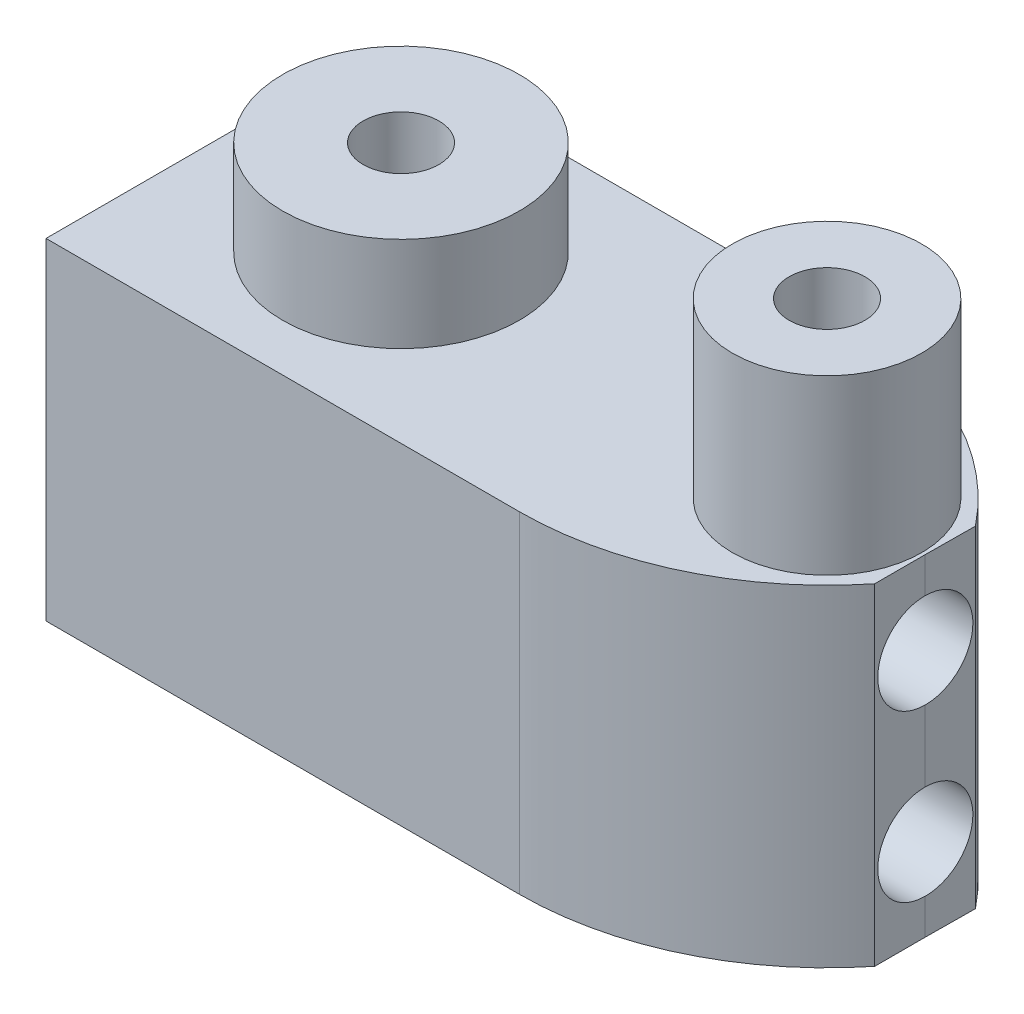
ISO-10303-21;
HEADER;
FILE_DESCRIPTION(('STEP AP214'),'2;1');
FILE_NAME('part.step','',(''),(''),'','','');
FILE_SCHEMA(('AUTOMOTIVE_DESIGN { 1 0 10303 214 1 1 1 1 }'));
ENDSEC;
DATA;
#1=APPLICATION_CONTEXT('core data for automotive mechanical design processes');
#2=APPLICATION_PROTOCOL_DEFINITION('international standard','automotive_design',2000,#1);
#3=PRODUCT_CONTEXT('',#1,'mechanical');
#4=PRODUCT('Part','Part','',(#3));
#5=PRODUCT_RELATED_PRODUCT_CATEGORY('part','',(#4));
#6=PRODUCT_DEFINITION_FORMATION('','',#4);
#7=PRODUCT_DEFINITION_CONTEXT('part definition',#1,'design');
#8=PRODUCT_DEFINITION('design','',#6,#7);
#9=PRODUCT_DEFINITION_SHAPE('','',#8);
#10=(LENGTH_UNIT() NAMED_UNIT(*) SI_UNIT(.MILLI.,.METRE.));
#11=(NAMED_UNIT(*) PLANE_ANGLE_UNIT() SI_UNIT($,.RADIAN.));
#12=(NAMED_UNIT(*) SI_UNIT($,.STERADIAN.) SOLID_ANGLE_UNIT());
#13=UNCERTAINTY_MEASURE_WITH_UNIT(LENGTH_MEASURE(1.E-05),#10,'distance_accuracy_value','');
#14=(GEOMETRIC_REPRESENTATION_CONTEXT(3) GLOBAL_UNCERTAINTY_ASSIGNED_CONTEXT((#13)) GLOBAL_UNIT_ASSIGNED_CONTEXT((#10,
#11,#12)) REPRESENTATION_CONTEXT('',''));
#15=CARTESIAN_POINT('',(0.,0.,0.));
#16=DIRECTION('',(0.,0.,1.));
#17=DIRECTION('',(1.,0.,0.));
#18=AXIS2_PLACEMENT_3D('',#15,#16,#17);
#19=CARTESIAN_POINT('',(3.5,14.,-6.));
#20=DIRECTION('',(0.,-1.,0.));
#21=DIRECTION('',(0.,0.,-1.));
#22=AXIS2_PLACEMENT_3D('',#19,#20,#21);
#23=CYLINDRICAL_SURFACE('',#22,13.);
#24=CARTESIAN_POINT('',(3.5,0.,-6.));
#25=DIRECTION('',(0.,1.,0.));
#26=DIRECTION('',(0.,0.,1.));
#27=AXIS2_PLACEMENT_3D('',#24,#25,#26);
#28=CIRCLE('',#27,13.);
#29=CARTESIAN_POINT('',(13.6440740438536,0.,2.13005300061545));
#30=VERTEX_POINT('',#29);
#31=CARTESIAN_POINT('',(3.5,0.,7.));
#32=VERTEX_POINT('',#31);
#33=EDGE_CURVE('E158',#30,#32,#28,.F.);
#34=ORIENTED_EDGE('',*,*,#33,.F.);
#35=DIRECTION('',(0.,-1.,0.));
#36=VECTOR('',#35,1.);
#37=CARTESIAN_POINT('',(13.6440740438536,21.3,2.13005300061545));
#38=LINE('',#37,#36);
#39=CARTESIAN_POINT('',(13.6440740438536,14.,2.13005300061545));
#40=VERTEX_POINT('',#39);
#41=EDGE_CURVE('E143',#40,#30,#38,.T.);
#42=ORIENTED_EDGE('',*,*,#41,.F.);
#43=CARTESIAN_POINT('',(3.5,14.,-6.));
#44=DIRECTION('',(0.,1.,0.));
#45=DIRECTION('',(0.,0.,1.));
#46=AXIS2_PLACEMENT_3D('',#43,#44,#45);
#47=CIRCLE('',#46,13.);
#48=CARTESIAN_POINT('',(3.5,14.,7.));
#49=VERTEX_POINT('',#48);
#50=EDGE_CURVE('E157',#49,#40,#47,.T.);
#51=ORIENTED_EDGE('',*,*,#50,.F.);
#52=DIRECTION('',(0.,-1.,0.));
#53=VECTOR('',#52,1.);
#54=CARTESIAN_POINT('',(3.5,14.,7.));
#55=LINE('',#54,#53);
#56=EDGE_CURVE('E168',#32,#49,#55,.F.);
#57=ORIENTED_EDGE('',*,*,#56,.F.);
#58=EDGE_LOOP('',(#34,#42,#51,#57));
#59=FACE_BOUND('',#58,.T.);
#60=ADVANCED_FACE('F49',(#59),#23,.T.);
#61=CARTESIAN_POINT('',(-16.5,14.,-7.));
#62=DIRECTION('',(0.,0.,1.));
#63=DIRECTION('',(1.,0.,0.));
#64=AXIS2_PLACEMENT_3D('',#61,#62,#63);
#65=PLANE('',#64);
#66=DIRECTION('',(-1.,0.,0.));
#67=VECTOR('',#66,1.);
#68=CARTESIAN_POINT('',(-16.5,14.,-7.));
#69=LINE('',#68,#67);
#70=CARTESIAN_POINT('',(3.50000000000001,14.,-7.));
#71=VERTEX_POINT('',#70);
#72=CARTESIAN_POINT('',(-16.5,14.,-7.));
#73=VERTEX_POINT('',#72);
#74=EDGE_CURVE('E235',#71,#73,#69,.T.);
#75=ORIENTED_EDGE('',*,*,#74,.F.);
#76=DIRECTION('',(0.,-1.,0.));
#77=VECTOR('',#76,1.);
#78=CARTESIAN_POINT('',(3.50000000000001,14.,-7.));
#79=LINE('',#78,#77);
#80=CARTESIAN_POINT('',(3.50000000000001,0.,-7.));
#81=VERTEX_POINT('',#80);
#82=EDGE_CURVE('E259',#71,#81,#79,.T.);
#83=ORIENTED_EDGE('',*,*,#82,.T.);
#84=DIRECTION('',(-1.,0.,0.));
#85=VECTOR('',#84,1.);
#86=CARTESIAN_POINT('',(-16.5,0.,-7.));
#87=LINE('',#86,#85);
#88=CARTESIAN_POINT('',(-16.5,0.,-7.));
#89=VERTEX_POINT('',#88);
#90=EDGE_CURVE('E228',#81,#89,#87,.T.);
#91=ORIENTED_EDGE('',*,*,#90,.T.);
#92=DIRECTION('',(0.,-1.,0.));
#93=VECTOR('',#92,1.);
#94=CARTESIAN_POINT('',(-16.5,14.,-7.));
#95=LINE('',#94,#93);
#96=EDGE_CURVE('E249',#73,#89,#95,.T.);
#97=ORIENTED_EDGE('',*,*,#96,.F.);
#98=EDGE_LOOP('',(#75,#83,#91,#97));
#99=FACE_BOUND('',#98,.T.);
#100=ADVANCED_FACE('F276',(#99),#65,.F.);
#101=CARTESIAN_POINT('',(-16.5,14.,-7.));
#102=DIRECTION('',(1.,0.,0.));
#103=DIRECTION('',(0.,0.,-1.));
#104=AXIS2_PLACEMENT_3D('',#101,#102,#103);
#105=PLANE('',#104);
#106=DIRECTION('',(0.,-1.,0.));
#107=VECTOR('',#106,1.);
#108=CARTESIAN_POINT('',(-16.5,13.,5.));
#109=LINE('',#108,#107);
#110=CARTESIAN_POINT('',(-16.5,13.,5.));
#111=VERTEX_POINT('',#110);
#112=CARTESIAN_POINT('',(-16.5,0.999999999999999,5.));
#113=VERTEX_POINT('',#112);
#114=EDGE_CURVE('E217',#111,#113,#109,.T.);
#115=ORIENTED_EDGE('',*,*,#114,.T.);
#116=DIRECTION('',(0.,0.,1.));
#117=VECTOR('',#116,1.);
#118=CARTESIAN_POINT('',(-16.5,1.,-5.));
#119=LINE('',#118,#117);
#120=CARTESIAN_POINT('',(-16.5,1.,-5.));
#121=VERTEX_POINT('',#120);
#122=EDGE_CURVE('E215',#121,#113,#119,.T.);
#123=ORIENTED_EDGE('',*,*,#122,.F.);
#124=DIRECTION('',(0.,-1.,0.));
#125=VECTOR('',#124,1.);
#126=CARTESIAN_POINT('',(-16.5,13.,-5.));
#127=LINE('',#126,#125);
#128=CARTESIAN_POINT('',(-16.5,13.,-5.));
#129=VERTEX_POINT('',#128);
#130=EDGE_CURVE('E207',#129,#121,#127,.T.);
#131=ORIENTED_EDGE('',*,*,#130,.F.);
#132=DIRECTION('',(0.,0.,1.));
#133=VECTOR('',#132,1.);
#134=CARTESIAN_POINT('',(-16.5,13.,-5.));
#135=LINE('',#134,#133);
#136=EDGE_CURVE('E221',#129,#111,#135,.T.);
#137=ORIENTED_EDGE('',*,*,#136,.T.);
#138=EDGE_LOOP('',(#115,#123,#131,#137));
#139=FACE_BOUND('',#138,.T.);
#140=DIRECTION('',(0.,0.,1.));
#141=VECTOR('',#140,1.);
#142=CARTESIAN_POINT('',(-16.5,0.,-7.));
#143=LINE('',#142,#141);
#144=CARTESIAN_POINT('',(-16.5,0.,7.));
#145=VERTEX_POINT('',#144);
#146=EDGE_CURVE('E243',#89,#145,#143,.T.);
#147=ORIENTED_EDGE('',*,*,#146,.T.);
#148=DIRECTION('',(0.,-1.,0.));
#149=VECTOR('',#148,1.);
#150=CARTESIAN_POINT('',(-16.5,14.,7.));
#151=LINE('',#150,#149);
#152=CARTESIAN_POINT('',(-16.5,14.,7.));
#153=VERTEX_POINT('',#152);
#154=EDGE_CURVE('E241',#153,#145,#151,.T.);
#155=ORIENTED_EDGE('',*,*,#154,.F.);
#156=DIRECTION('',(0.,0.,1.));
#157=VECTOR('',#156,1.);
#158=CARTESIAN_POINT('',(-16.5,14.,-7.));
#159=LINE('',#158,#157);
#160=EDGE_CURVE('E237',#73,#153,#159,.T.);
#161=ORIENTED_EDGE('',*,*,#160,.F.);
#162=ORIENTED_EDGE('',*,*,#96,.T.);
#163=EDGE_LOOP('',(#147,#155,#161,#162));
#164=FACE_BOUND('',#163,.T.);
#165=ADVANCED_FACE('F271',(#139,#164),#105,.F.);
#166=CARTESIAN_POINT('',(-16.5,14.,7.));
#167=DIRECTION('',(0.,0.,-1.));
#168=DIRECTION('',(-1.,0.,0.));
#169=AXIS2_PLACEMENT_3D('',#166,#167,#168);
#170=PLANE('',#169);
#171=DIRECTION('',(1.,0.,0.));
#172=VECTOR('',#171,1.);
#173=CARTESIAN_POINT('',(-16.5,0.,7.));
#174=LINE('',#173,#172);
#175=EDGE_CURVE('E238',#145,#32,#174,.T.);
#176=ORIENTED_EDGE('',*,*,#175,.T.);
#177=ORIENTED_EDGE('',*,*,#56,.T.);
#178=DIRECTION('',(1.,0.,0.));
#179=VECTOR('',#178,1.);
#180=CARTESIAN_POINT('',(-16.5,14.,7.));
#181=LINE('',#180,#179);
#182=EDGE_CURVE('E164',#153,#49,#181,.T.);
#183=ORIENTED_EDGE('',*,*,#182,.F.);
#184=ORIENTED_EDGE('',*,*,#154,.T.);
#185=EDGE_LOOP('',(#176,#177,#183,#184));
#186=FACE_BOUND('',#185,.T.);
#187=ADVANCED_FACE('F267',(#186),#170,.F.);
#188=CARTESIAN_POINT('',(0.,14.,0.));
#189=DIRECTION('',(0.,1.,0.));
#190=DIRECTION('',(0.,0.,1.));
#191=AXIS2_PLACEMENT_3D('',#188,#189,#190);
#192=PLANE('',#191);
#193=DIRECTION('',(-0.00887810960126429,0.,0.999960588808333));
#194=VECTOR('',#193,1.);
#195=CARTESIAN_POINT('',(13.6429986066116,14.,0.121128810750171));
#196=LINE('',#195,#194);
#197=CARTESIAN_POINT('',(13.6627779438096,14.,-2.1066605001577));
#198=VERTEX_POINT('',#197);
#199=CARTESIAN_POINT('',(13.6440740438536,14.,0.));
#200=VERTEX_POINT('',#199);
#201=EDGE_CURVE('E284',#198,#200,#196,.T.);
#202=ORIENTED_EDGE('',*,*,#201,.F.);
#203=CARTESIAN_POINT('',(3.50000000000001,14.,6.));
#204=DIRECTION('',(0.,1.,0.));
#205=DIRECTION('',(0.,0.,1.));
#206=AXIS2_PLACEMENT_3D('',#203,#204,#205);
#207=CIRCLE('',#206,13.);
#208=EDGE_CURVE('E165',#198,#71,#207,.T.);
#209=ORIENTED_EDGE('',*,*,#208,.T.);
#210=ORIENTED_EDGE('',*,*,#74,.T.);
#211=ORIENTED_EDGE('',*,*,#160,.T.);
#212=ORIENTED_EDGE('',*,*,#182,.T.);
#213=ORIENTED_EDGE('',*,*,#50,.T.);
#214=DIRECTION('',(0.,0.,-1.));
#215=VECTOR('',#214,1.);
#216=CARTESIAN_POINT('',(13.6440740438536,14.,0.));
#217=LINE('',#216,#215);
#218=EDGE_CURVE('E140',#40,#200,#217,.T.);
#219=ORIENTED_EDGE('',*,*,#218,.T.);
#220=EDGE_LOOP('',(#202,#209,#210,#211,#212,#213,#219));
#221=FACE_BOUND('',#220,.T.);
#222=CARTESIAN_POINT('',(9.50000000000487,14.,-9.87057657830803E-13));
#223=DIRECTION('',(0.,1.,0.));
#224=DIRECTION('',(0.,0.,1.));
#225=AXIS2_PLACEMENT_3D('',#222,#223,#224);
#226=CIRCLE('',#225,3.99999999999506);
#227=CARTESIAN_POINT('',(9.50000000000487,14.,3.99999999999407));
#228=VERTEX_POINT('',#227);
#229=EDGE_CURVE('E187',#228,#228,#226,.T.);
#230=ORIENTED_EDGE('',*,*,#229,.F.);
#231=EDGE_LOOP('',(#230));
#232=FACE_BOUND('',#231,.T.);
#233=CARTESIAN_POINT('',(-8.5,14.,0.));
#234=DIRECTION('',(0.,1.,0.));
#235=DIRECTION('',(0.,0.,1.));
#236=AXIS2_PLACEMENT_3D('',#233,#234,#235);
#237=CIRCLE('',#236,5.);
#238=CARTESIAN_POINT('',(-8.5,14.,5.));
#239=VERTEX_POINT('',#238);
#240=EDGE_CURVE('E191',#239,#239,#237,.T.);
#241=ORIENTED_EDGE('',*,*,#240,.F.);
#242=EDGE_LOOP('',(#241));
#243=FACE_BOUND('',#242,.T.);
#244=ADVANCED_FACE('F161',(#221,#232,#243),#192,.T.);
#245=CARTESIAN_POINT('',(0.,0.,0.));
#246=DIRECTION('',(0.,1.,0.));
#247=DIRECTION('',(0.,0.,1.));
#248=AXIS2_PLACEMENT_3D('',#245,#246,#247);
#249=PLANE('',#248);
#250=CARTESIAN_POINT('',(-8.5,0.,0.));
#251=DIRECTION('',(0.,-1.,0.));
#252=DIRECTION('',(0.,0.,-1.));
#253=AXIS2_PLACEMENT_3D('',#250,#251,#252);
#254=CIRCLE('',#253,2.5);
#255=CARTESIAN_POINT('',(-8.5,0.,-2.5));
#256=VERTEX_POINT('',#255);
#257=EDGE_CURVE('E56',#256,#256,#254,.T.);
#258=ORIENTED_EDGE('',*,*,#257,.F.);
#259=EDGE_LOOP('',(#258));
#260=FACE_BOUND('',#259,.T.);
#261=CARTESIAN_POINT('',(3.50000000000001,0.,6.));
#262=DIRECTION('',(0.,1.,0.));
#263=DIRECTION('',(0.,0.,1.));
#264=AXIS2_PLACEMENT_3D('',#261,#262,#263);
#265=CIRCLE('',#264,13.);
#266=CARTESIAN_POINT('',(13.6627779438096,0.,-2.1066605001577));
#267=VERTEX_POINT('',#266);
#268=EDGE_CURVE('E166',#81,#267,#265,.F.);
#269=ORIENTED_EDGE('',*,*,#268,.T.);
#270=DIRECTION('',(-0.00887810960126429,0.,0.999960588808333));
#271=VECTOR('',#270,1.);
#272=CARTESIAN_POINT('',(13.6429986066116,0.,0.121128810750171));
#273=LINE('',#272,#271);
#274=CARTESIAN_POINT('',(13.6440740438536,0.,0.));
#275=VERTEX_POINT('',#274);
#276=EDGE_CURVE('E285',#267,#275,#273,.T.);
#277=ORIENTED_EDGE('',*,*,#276,.T.);
#278=DIRECTION('',(0.,0.,-1.));
#279=VECTOR('',#278,1.);
#280=CARTESIAN_POINT('',(13.6440740438536,0.,0.));
#281=LINE('',#280,#279);
#282=EDGE_CURVE('E151',#30,#275,#281,.T.);
#283=ORIENTED_EDGE('',*,*,#282,.F.);
#284=ORIENTED_EDGE('',*,*,#33,.T.);
#285=ORIENTED_EDGE('',*,*,#175,.F.);
#286=ORIENTED_EDGE('',*,*,#146,.F.);
#287=ORIENTED_EDGE('',*,*,#90,.F.);
#288=EDGE_LOOP('',(#269,#277,#283,#284,#285,#286,#287));
#289=FACE_BOUND('',#288,.T.);
#290=ADVANCED_FACE('F263',(#260,#289),#249,.F.);
#291=CARTESIAN_POINT('',(8.8,1.,-5.));
#292=DIRECTION('',(0.,-1.,0.));
#293=DIRECTION('',(0.,0.,-1.));
#294=AXIS2_PLACEMENT_3D('',#291,#292,#293);
#295=PLANE('',#294);
#296=ORIENTED_EDGE('',*,*,#122,.T.);
#297=DIRECTION('',(-1.,0.,0.));
#298=VECTOR('',#297,1.);
#299=CARTESIAN_POINT('',(8.8,1.,5.));
#300=LINE('',#299,#298);
#301=CARTESIAN_POINT('',(8.8,1.,5.));
#302=VERTEX_POINT('',#301);
#303=EDGE_CURVE('E214',#302,#113,#300,.T.);
#304=ORIENTED_EDGE('',*,*,#303,.F.);
#305=DIRECTION('',(0.,0.,1.));
#306=VECTOR('',#305,1.);
#307=CARTESIAN_POINT('',(8.8,1.,-5.));
#308=LINE('',#307,#306);
#309=CARTESIAN_POINT('',(8.8,1.,-5.));
#310=VERTEX_POINT('',#309);
#311=EDGE_CURVE('E203',#310,#302,#308,.T.);
#312=ORIENTED_EDGE('',*,*,#311,.F.);
#313=DIRECTION('',(-1.,0.,0.));
#314=VECTOR('',#313,1.);
#315=CARTESIAN_POINT('',(8.8,1.,-5.));
#316=LINE('',#315,#314);
#317=EDGE_CURVE('E226',#310,#121,#316,.T.);
#318=ORIENTED_EDGE('',*,*,#317,.T.);
#319=EDGE_LOOP('',(#296,#304,#312,#318));
#320=FACE_BOUND('',#319,.T.);
#321=ADVANCED_FACE('F326',(#320),#295,.F.);
#322=CARTESIAN_POINT('',(8.8,13.,-5.));
#323=DIRECTION('',(0.,0.,-1.));
#324=DIRECTION('',(0.,1.,0.));
#325=AXIS2_PLACEMENT_3D('',#322,#323,#324);
#326=PLANE('',#325);
#327=ORIENTED_EDGE('',*,*,#130,.T.);
#328=ORIENTED_EDGE('',*,*,#317,.F.);
#329=DIRECTION('',(0.,-1.,0.));
#330=VECTOR('',#329,1.);
#331=CARTESIAN_POINT('',(8.8,13.,-5.));
#332=LINE('',#331,#330);
#333=CARTESIAN_POINT('',(8.8,13.,-5.));
#334=VERTEX_POINT('',#333);
#335=EDGE_CURVE('E211',#334,#310,#332,.T.);
#336=ORIENTED_EDGE('',*,*,#335,.F.);
#337=DIRECTION('',(-1.,0.,0.));
#338=VECTOR('',#337,1.);
#339=CARTESIAN_POINT('',(8.8,13.,-5.));
#340=LINE('',#339,#338);
#341=EDGE_CURVE('E229',#334,#129,#340,.T.);
#342=ORIENTED_EDGE('',*,*,#341,.T.);
#343=EDGE_LOOP('',(#327,#328,#336,#342));
#344=FACE_BOUND('',#343,.T.);
#345=ADVANCED_FACE('F337',(#344),#326,.F.);
#346=CARTESIAN_POINT('',(8.8,13.,-5.));
#347=DIRECTION('',(0.,-1.,0.));
#348=DIRECTION('',(0.,0.,-1.));
#349=AXIS2_PLACEMENT_3D('',#346,#347,#348);
#350=PLANE('',#349);
#351=ORIENTED_EDGE('',*,*,#136,.F.);
#352=ORIENTED_EDGE('',*,*,#341,.F.);
#353=DIRECTION('',(0.,0.,1.));
#354=VECTOR('',#353,1.);
#355=CARTESIAN_POINT('',(8.8,13.,-5.));
#356=LINE('',#355,#354);
#357=CARTESIAN_POINT('',(8.8,13.,5.));
#358=VERTEX_POINT('',#357);
#359=EDGE_CURVE('E209',#334,#358,#356,.T.);
#360=ORIENTED_EDGE('',*,*,#359,.T.);
#361=DIRECTION('',(-1.,0.,0.));
#362=VECTOR('',#361,1.);
#363=CARTESIAN_POINT('',(8.8,13.,5.));
#364=LINE('',#363,#362);
#365=EDGE_CURVE('E231',#358,#111,#364,.T.);
#366=ORIENTED_EDGE('',*,*,#365,.T.);
#367=EDGE_LOOP('',(#351,#352,#360,#366));
#368=FACE_BOUND('',#367,.T.);
#369=ADVANCED_FACE('F335',(#368),#350,.T.);
#370=CARTESIAN_POINT('',(8.8,13.,5.));
#371=DIRECTION('',(0.,0.,-1.));
#372=DIRECTION('',(-1.,0.,0.));
#373=AXIS2_PLACEMENT_3D('',#370,#371,#372);
#374=PLANE('',#373);
#375=ORIENTED_EDGE('',*,*,#114,.F.);
#376=ORIENTED_EDGE('',*,*,#365,.F.);
#377=DIRECTION('',(0.,-1.,0.));
#378=VECTOR('',#377,1.);
#379=CARTESIAN_POINT('',(8.8,13.,5.));
#380=LINE('',#379,#378);
#381=EDGE_CURVE('E206',#358,#302,#380,.T.);
#382=ORIENTED_EDGE('',*,*,#381,.T.);
#383=ORIENTED_EDGE('',*,*,#303,.T.);
#384=EDGE_LOOP('',(#375,#376,#382,#383));
#385=FACE_BOUND('',#384,.T.);
#386=ADVANCED_FACE('F316',(#385),#374,.T.);
#387=CARTESIAN_POINT('',(8.8,0.,0.));
#388=DIRECTION('',(1.,0.,0.));
#389=DIRECTION('',(0.,0.,-1.));
#390=AXIS2_PLACEMENT_3D('',#387,#388,#389);
#391=PLANE('',#390);
#392=CARTESIAN_POINT('',(8.8,10.5,0.));
#393=DIRECTION('',(1.,0.,0.));
#394=DIRECTION('',(0.,0.,-1.));
#395=AXIS2_PLACEMENT_3D('',#392,#393,#394);
#396=CIRCLE('',#395,2.);
#397=CARTESIAN_POINT('',(8.8,10.5,-2.));
#398=VERTEX_POINT('',#397);
#399=EDGE_CURVE('E218',#398,#398,#396,.T.);
#400=ORIENTED_EDGE('',*,*,#399,.T.);
#401=EDGE_LOOP('',(#400));
#402=FACE_BOUND('',#401,.T.);
#403=CARTESIAN_POINT('',(8.8,3.5,0.));
#404=DIRECTION('',(1.,0.,0.));
#405=DIRECTION('',(0.,0.,-1.));
#406=AXIS2_PLACEMENT_3D('',#403,#404,#405);
#407=CIRCLE('',#406,2.);
#408=CARTESIAN_POINT('',(8.8,3.5,-2.));
#409=VERTEX_POINT('',#408);
#410=EDGE_CURVE('E200',#409,#409,#407,.T.);
#411=ORIENTED_EDGE('',*,*,#410,.T.);
#412=EDGE_LOOP('',(#411));
#413=FACE_BOUND('',#412,.T.);
#414=ORIENTED_EDGE('',*,*,#311,.T.);
#415=ORIENTED_EDGE('',*,*,#381,.F.);
#416=ORIENTED_EDGE('',*,*,#359,.F.);
#417=ORIENTED_EDGE('',*,*,#335,.T.);
#418=EDGE_LOOP('',(#414,#415,#416,#417));
#419=FACE_BOUND('',#418,.T.);
#420=ADVANCED_FACE('F313',(#402,#413,#419),#391,.F.);
#421=CARTESIAN_POINT('',(-8.99999999999999,3.5,0.));
#422=DIRECTION('',(1.,0.,0.));
#423=DIRECTION('',(0.,0.,-1.));
#424=AXIS2_PLACEMENT_3D('',#421,#422,#423);
#425=CYLINDRICAL_SURFACE('',#424,2.);
#426=CARTESIAN_POINT('',(13.6440740438536,3.5,0.));
#427=DIRECTION('',(1.,0.,0.));
#428=DIRECTION('',(0.,0.,-1.));
#429=AXIS2_PLACEMENT_3D('',#426,#427,#428);
#430=CIRCLE('',#429,2.);
#431=CARTESIAN_POINT('',(13.6440740438536,1.5,0.));
#432=VERTEX_POINT('',#431);
#433=CARTESIAN_POINT('',(13.6440740438536,5.5,0.));
#434=VERTEX_POINT('',#433);
#435=EDGE_CURVE('E288',#432,#434,#430,.F.);
#436=ORIENTED_EDGE('',*,*,#435,.F.);
#437=CARTESIAN_POINT('',(13.6440740438536,3.5,0.));
#438=DIRECTION('',(-0.999960588808333,0.,-0.00887810960126429));
#439=DIRECTION('',(0.00887810960126429,0.,-0.999960588808333));
#440=AXIS2_PLACEMENT_3D('',#437,#438,#439);
#441=ELLIPSE('',#440,2.00007882548994,2.);
#442=EDGE_CURVE('E290',#432,#434,#441,.F.);
#443=ORIENTED_EDGE('',*,*,#442,.T.);
#444=EDGE_LOOP('',(#436,#443));
#445=FACE_BOUND('',#444,.T.);
#446=ORIENTED_EDGE('',*,*,#410,.F.);
#447=EDGE_LOOP('',(#446));
#448=FACE_BOUND('',#447,.T.);
#449=ADVANCED_FACE('F304',(#445,#448),#425,.F.);
#450=CARTESIAN_POINT('',(-8.99999999999999,10.5,0.));
#451=DIRECTION('',(1.,0.,0.));
#452=DIRECTION('',(0.,0.,-1.));
#453=AXIS2_PLACEMENT_3D('',#450,#451,#452);
#454=CYLINDRICAL_SURFACE('',#453,2.);
#455=CARTESIAN_POINT('',(13.6440740438536,10.5,0.));
#456=DIRECTION('',(1.,0.,0.));
#457=DIRECTION('',(0.,0.,-1.));
#458=AXIS2_PLACEMENT_3D('',#455,#456,#457);
#459=CIRCLE('',#458,2.);
#460=CARTESIAN_POINT('',(13.6440740438536,8.5,0.));
#461=VERTEX_POINT('',#460);
#462=CARTESIAN_POINT('',(13.6440740438536,12.5,0.));
#463=VERTEX_POINT('',#462);
#464=EDGE_CURVE('E286',#461,#463,#459,.F.);
#465=ORIENTED_EDGE('',*,*,#464,.F.);
#466=CARTESIAN_POINT('',(13.6440740438536,10.5,0.));
#467=DIRECTION('',(-0.999960588808333,0.,-0.00887810960126429));
#468=DIRECTION('',(0.00887810960126429,0.,-0.999960588808333));
#469=AXIS2_PLACEMENT_3D('',#466,#467,#468);
#470=ELLIPSE('',#469,2.00007882548994,2.);
#471=EDGE_CURVE('E299',#461,#463,#470,.F.);
#472=ORIENTED_EDGE('',*,*,#471,.T.);
#473=EDGE_LOOP('',(#465,#472));
#474=FACE_BOUND('',#473,.T.);
#475=ORIENTED_EDGE('',*,*,#399,.F.);
#476=EDGE_LOOP('',(#475));
#477=FACE_BOUND('',#476,.T.);
#478=ADVANCED_FACE('F306',(#474,#477),#454,.F.);
#479=CARTESIAN_POINT('',(-8.5,18.,0.));
#480=DIRECTION('',(0.,-1.,0.));
#481=DIRECTION('',(0.,0.,-1.));
#482=AXIS2_PLACEMENT_3D('',#479,#480,#481);
#483=CYLINDRICAL_SURFACE('',#482,1.6);
#484=CARTESIAN_POINT('',(-8.5,18.,0.));
#485=DIRECTION('',(0.,1.,0.));
#486=DIRECTION('',(0.,0.,1.));
#487=AXIS2_PLACEMENT_3D('',#484,#485,#486);
#488=CIRCLE('',#487,1.6);
#489=CARTESIAN_POINT('',(-8.5,18.,1.6));
#490=VERTEX_POINT('',#489);
#491=EDGE_CURVE('E194',#490,#490,#488,.T.);
#492=ORIENTED_EDGE('',*,*,#491,.T.);
#493=EDGE_LOOP('',(#492));
#494=FACE_BOUND('',#493,.T.);
#495=CARTESIAN_POINT('',(-8.5,14.,0.));
#496=DIRECTION('',(0.,1.,0.));
#497=DIRECTION('',(0.,0.,1.));
#498=AXIS2_PLACEMENT_3D('',#495,#496,#497);
#499=CIRCLE('',#498,1.6);
#500=CARTESIAN_POINT('',(-8.5,14.,1.6));
#501=VERTEX_POINT('',#500);
#502=EDGE_CURVE('E252',#501,#501,#499,.F.);
#503=ORIENTED_EDGE('',*,*,#502,.T.);
#504=EDGE_LOOP('',(#503));
#505=FACE_BOUND('',#504,.T.);
#506=ADVANCED_FACE('F309',(#494,#505),#483,.F.);
#507=CARTESIAN_POINT('',(-8.5,18.,0.));
#508=DIRECTION('',(0.,-1.,0.));
#509=DIRECTION('',(0.,0.,-1.));
#510=AXIS2_PLACEMENT_3D('',#507,#508,#509);
#511=CYLINDRICAL_SURFACE('',#510,5.);
#512=CARTESIAN_POINT('',(-8.5,18.,0.));
#513=DIRECTION('',(0.,1.,0.));
#514=DIRECTION('',(0.,0.,1.));
#515=AXIS2_PLACEMENT_3D('',#512,#513,#514);
#516=CIRCLE('',#515,5.);
#517=CARTESIAN_POINT('',(-8.5,18.,5.));
#518=VERTEX_POINT('',#517);
#519=EDGE_CURVE('E197',#518,#518,#516,.T.);
#520=ORIENTED_EDGE('',*,*,#519,.F.);
#521=EDGE_LOOP('',(#520));
#522=FACE_BOUND('',#521,.T.);
#523=ORIENTED_EDGE('',*,*,#240,.T.);
#524=EDGE_LOOP('',(#523));
#525=FACE_BOUND('',#524,.T.);
#526=ADVANCED_FACE('F377',(#522,#525),#511,.T.);
#527=CARTESIAN_POINT('',(0.,18.,0.));
#528=DIRECTION('',(0.,1.,0.));
#529=DIRECTION('',(0.,0.,1.));
#530=AXIS2_PLACEMENT_3D('',#527,#528,#529);
#531=PLANE('',#530);
#532=ORIENTED_EDGE('',*,*,#491,.F.);
#533=EDGE_LOOP('',(#532));
#534=FACE_BOUND('',#533,.T.);
#535=ORIENTED_EDGE('',*,*,#519,.T.);
#536=EDGE_LOOP('',(#535));
#537=FACE_BOUND('',#536,.T.);
#538=ADVANCED_FACE('F370',(#534,#537),#531,.T.);
#539=ORIENTED_EDGE('',*,*,#502,.F.);
#540=EDGE_LOOP('',(#539));
#541=FACE_BOUND('',#540,.T.);
#542=ADVANCED_FACE('F362',(#541),#192,.T.);
#543=CARTESIAN_POINT('',(3.50000000000001,14.,6.));
#544=DIRECTION('',(0.,-1.,0.));
#545=DIRECTION('',(0.,0.,-1.));
#546=AXIS2_PLACEMENT_3D('',#543,#544,#545);
#547=CYLINDRICAL_SURFACE('',#546,13.);
#548=DIRECTION('',(0.,-1.,0.));
#549=VECTOR('',#548,1.);
#550=CARTESIAN_POINT('',(13.6627779438096,14.,-2.1066605001577));
#551=LINE('',#550,#549);
#552=EDGE_CURVE('E12',#267,#198,#551,.F.);
#553=ORIENTED_EDGE('',*,*,#552,.F.);
#554=ORIENTED_EDGE('',*,*,#268,.F.);
#555=ORIENTED_EDGE('',*,*,#82,.F.);
#556=ORIENTED_EDGE('',*,*,#208,.F.);
#557=EDGE_LOOP('',(#553,#554,#555,#556));
#558=FACE_BOUND('',#557,.T.);
#559=ADVANCED_FACE('F281',(#558),#547,.T.);
#560=CARTESIAN_POINT('',(9.50000000000487,21.3,-9.87057657830803E-13));
#561=DIRECTION('',(0.,1.,0.));
#562=DIRECTION('',(0.,0.,1.));
#563=AXIS2_PLACEMENT_3D('',#560,#561,#562);
#564=PLANE('',#563);
#565=CARTESIAN_POINT('',(9.50000000000487,21.3,-9.87057657830803E-13));
#566=DIRECTION('',(0.,1.,0.));
#567=DIRECTION('',(0.,0.,1.));
#568=AXIS2_PLACEMENT_3D('',#565,#566,#567);
#569=CIRCLE('',#568,3.99999999999506);
#570=CARTESIAN_POINT('',(9.50000000000487,21.3,3.99999999999407));
#571=VERTEX_POINT('',#570);
#572=EDGE_CURVE('E188',#571,#571,#569,.T.);
#573=ORIENTED_EDGE('',*,*,#572,.T.);
#574=EDGE_LOOP('',(#573));
#575=FACE_BOUND('',#574,.T.);
#576=CARTESIAN_POINT('',(9.50000000000487,21.3,-9.87057657830803E-13));
#577=DIRECTION('',(0.,1.,0.));
#578=DIRECTION('',(0.,0.,1.));
#579=AXIS2_PLACEMENT_3D('',#576,#577,#578);
#580=CIRCLE('',#579,1.6);
#581=CARTESIAN_POINT('',(9.50000000000487,21.3,1.59999999999901));
#582=VERTEX_POINT('',#581);
#583=EDGE_CURVE('E184',#582,#582,#580,.T.);
#584=ORIENTED_EDGE('',*,*,#583,.F.);
#585=EDGE_LOOP('',(#584));
#586=FACE_BOUND('',#585,.T.);
#587=ADVANCED_FACE('F361',(#575,#586),#564,.T.);
#588=CARTESIAN_POINT('',(9.50000000000487,21.3,-9.87057657830803E-13));
#589=DIRECTION('',(0.,-1.,0.));
#590=DIRECTION('',(0.,0.,-1.));
#591=AXIS2_PLACEMENT_3D('',#588,#589,#590);
#592=CYLINDRICAL_SURFACE('',#591,3.99999999999506);
#593=ORIENTED_EDGE('',*,*,#572,.F.);
#594=EDGE_LOOP('',(#593));
#595=FACE_BOUND('',#594,.T.);
#596=ORIENTED_EDGE('',*,*,#229,.T.);
#597=EDGE_LOOP('',(#596));
#598=FACE_BOUND('',#597,.T.);
#599=ADVANCED_FACE('F367',(#595,#598),#592,.T.);
#600=CARTESIAN_POINT('',(9.50000000000487,21.3,-9.87057657830803E-13));
#601=DIRECTION('',(0.,-1.,0.));
#602=DIRECTION('',(0.,0.,-1.));
#603=AXIS2_PLACEMENT_3D('',#600,#601,#602);
#604=CYLINDRICAL_SURFACE('',#603,1.6);
#605=ORIENTED_EDGE('',*,*,#583,.T.);
#606=EDGE_LOOP('',(#605));
#607=FACE_BOUND('',#606,.T.);
#608=CARTESIAN_POINT('',(9.50000000000487,14.,-9.87057657830803E-13));
#609=DIRECTION('',(0.,1.,0.));
#610=DIRECTION('',(0.,0.,1.));
#611=AXIS2_PLACEMENT_3D('',#608,#609,#610);
#612=CIRCLE('',#611,1.6);
#613=CARTESIAN_POINT('',(9.50000000000487,14.,1.59999999999901));
#614=VERTEX_POINT('',#613);
#615=EDGE_CURVE('E174',#614,#614,#612,.F.);
#616=ORIENTED_EDGE('',*,*,#615,.T.);
#617=EDGE_LOOP('',(#616));
#618=FACE_BOUND('',#617,.T.);
#619=ADVANCED_FACE('F384',(#607,#618),#604,.F.);
#620=ORIENTED_EDGE('',*,*,#615,.F.);
#621=EDGE_LOOP('',(#620));
#622=FACE_BOUND('',#621,.T.);
#623=ADVANCED_FACE('F373',(#622),#192,.T.);
#624=CARTESIAN_POINT('',(-8.5,-4.,0.));
#625=DIRECTION('',(0.,1.,0.));
#626=DIRECTION('',(0.,0.,1.));
#627=AXIS2_PLACEMENT_3D('',#624,#625,#626);
#628=CYLINDRICAL_SURFACE('',#627,2.5);
#629=CARTESIAN_POINT('',(-8.5,-4.,0.));
#630=DIRECTION('',(0.,-1.,0.));
#631=DIRECTION('',(0.,0.,-1.));
#632=AXIS2_PLACEMENT_3D('',#629,#630,#631);
#633=CIRCLE('',#632,2.5);
#634=CARTESIAN_POINT('',(-8.5,-4.,-2.5));
#635=VERTEX_POINT('',#634);
#636=EDGE_CURVE('E150',#635,#635,#633,.T.);
#637=ORIENTED_EDGE('',*,*,#636,.F.);
#638=EDGE_LOOP('',(#637));
#639=FACE_BOUND('',#638,.T.);
#640=ORIENTED_EDGE('',*,*,#257,.T.);
#641=EDGE_LOOP('',(#640));
#642=FACE_BOUND('',#641,.T.);
#643=ADVANCED_FACE('F383',(#639,#642),#628,.T.);
#644=CARTESIAN_POINT('',(-8.5,-4.,0.));
#645=DIRECTION('',(0.,-1.,0.));
#646=DIRECTION('',(0.,0.,-1.));
#647=AXIS2_PLACEMENT_3D('',#644,#645,#646);
#648=PLANE('',#647);
#649=ORIENTED_EDGE('',*,*,#636,.T.);
#650=EDGE_LOOP('',(#649));
#651=FACE_BOUND('',#650,.T.);
#652=ADVANCED_FACE('F390',(#651),#648,.T.);
#653=CARTESIAN_POINT('',(13.6440740438536,21.3,0.));
#654=DIRECTION('',(1.,0.,0.));
#655=DIRECTION('',(0.,0.,-1.));
#656=AXIS2_PLACEMENT_3D('',#653,#654,#655);
#657=PLANE('',#656);
#658=ORIENTED_EDGE('',*,*,#41,.T.);
#659=ORIENTED_EDGE('',*,*,#282,.T.);
#660=DIRECTION('',(0.,-1.,0.));
#661=VECTOR('',#660,1.);
#662=CARTESIAN_POINT('',(13.6440740438536,21.3,0.));
#663=LINE('',#662,#661);
#664=EDGE_CURVE('E63',#432,#275,#663,.T.);
#665=ORIENTED_EDGE('',*,*,#664,.F.);
#666=ORIENTED_EDGE('',*,*,#435,.T.);
#667=EDGE_CURVE('E69',#461,#434,#663,.T.);
#668=ORIENTED_EDGE('',*,*,#667,.F.);
#669=ORIENTED_EDGE('',*,*,#464,.T.);
#670=EDGE_CURVE('E146',#200,#463,#663,.T.);
#671=ORIENTED_EDGE('',*,*,#670,.F.);
#672=ORIENTED_EDGE('',*,*,#218,.F.);
#673=EDGE_LOOP('',(#658,#659,#665,#666,#668,#669,#671,#672));
#674=FACE_BOUND('',#673,.T.);
#675=ADVANCED_FACE('F142',(#674),#657,.T.);
#676=CARTESIAN_POINT('',(13.6429986066116,21.3,0.121128810750171));
#677=DIRECTION('',(-0.999960588808333,0.,-0.00887810960126429));
#678=DIRECTION('',(-0.00887810960126429,0.,0.999960588808333));
#679=AXIS2_PLACEMENT_3D('',#676,#677,#678);
#680=PLANE('',#679);
#681=ORIENTED_EDGE('',*,*,#201,.T.);
#682=ORIENTED_EDGE('',*,*,#670,.T.);
#683=ORIENTED_EDGE('',*,*,#471,.F.);
#684=ORIENTED_EDGE('',*,*,#667,.T.);
#685=ORIENTED_EDGE('',*,*,#442,.F.);
#686=ORIENTED_EDGE('',*,*,#664,.T.);
#687=ORIENTED_EDGE('',*,*,#276,.F.);
#688=ORIENTED_EDGE('',*,*,#552,.T.);
#689=EDGE_LOOP('',(#681,#682,#683,#684,#685,#686,#687,#688));
#690=FACE_BOUND('',#689,.T.);
#691=ADVANCED_FACE('F283',(#690),#680,.F.);
#692=CLOSED_SHELL('',(#60,#100,#165,#187,#244,#290,#321,#345,#369,#386,#420,#449,#478,#506,#526,
#538,#542,#559,#587,#599,#619,#623,#643,#652,#675,#691));
#693=MANIFOLD_SOLID_BREP('B2',#692);
#694=ADVANCED_BREP_SHAPE_REPRESENTATION('',(#18,#693),#14);
#695=SHAPE_DEFINITION_REPRESENTATION(#9,#694);
ENDSEC;
END-ISO-10303-21;
